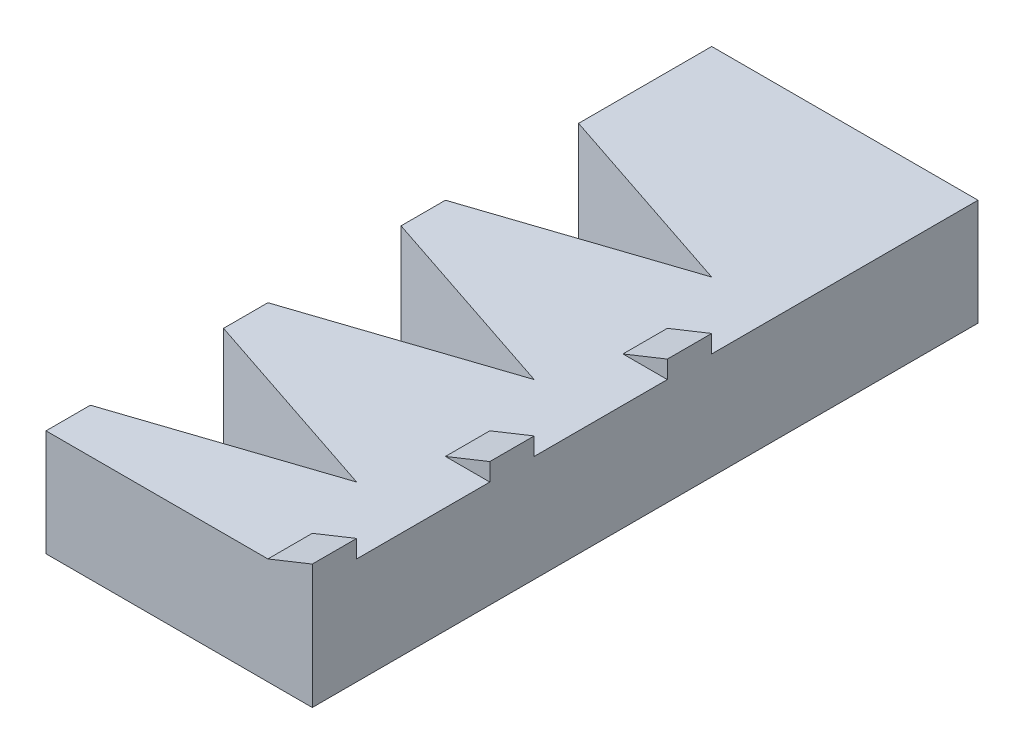
ISO-10303-21;
HEADER;
FILE_DESCRIPTION(('STEP AP214'),'2;1');
FILE_NAME('part.step','',(''),(''),'','','');
FILE_SCHEMA(('AUTOMOTIVE_DESIGN { 1 0 10303 214 1 1 1 1 }'));
ENDSEC;
DATA;
#1=APPLICATION_CONTEXT('core data for automotive mechanical design processes');
#2=APPLICATION_PROTOCOL_DEFINITION('international standard','automotive_design',2000,#1);
#3=PRODUCT_CONTEXT('',#1,'mechanical');
#4=PRODUCT('Part','Part','',(#3));
#5=PRODUCT_RELATED_PRODUCT_CATEGORY('part','',(#4));
#6=PRODUCT_DEFINITION_FORMATION('','',#4);
#7=PRODUCT_DEFINITION_CONTEXT('part definition',#1,'design');
#8=PRODUCT_DEFINITION('design','',#6,#7);
#9=PRODUCT_DEFINITION_SHAPE('','',#8);
#10=(LENGTH_UNIT() NAMED_UNIT(*) SI_UNIT(.MILLI.,.METRE.));
#11=(NAMED_UNIT(*) PLANE_ANGLE_UNIT() SI_UNIT($,.RADIAN.));
#12=(NAMED_UNIT(*) SI_UNIT($,.STERADIAN.) SOLID_ANGLE_UNIT());
#13=UNCERTAINTY_MEASURE_WITH_UNIT(LENGTH_MEASURE(1.E-05),#10,'distance_accuracy_value','');
#14=(GEOMETRIC_REPRESENTATION_CONTEXT(3) GLOBAL_UNCERTAINTY_ASSIGNED_CONTEXT((#13)) GLOBAL_UNIT_ASSIGNED_CONTEXT((#10,
#11,#12)) REPRESENTATION_CONTEXT('',''));
#15=CARTESIAN_POINT('',(0.,0.,0.));
#16=DIRECTION('',(0.,0.,1.));
#17=DIRECTION('',(1.,0.,0.));
#18=AXIS2_PLACEMENT_3D('',#15,#16,#17);
#19=CARTESIAN_POINT('',(0.,12.,0.));
#20=DIRECTION('',(0.,-1.,0.));
#21=DIRECTION('',(0.,0.,-1.));
#22=AXIS2_PLACEMENT_3D('',#19,#20,#21);
#23=PLANE('',#22);
#24=DIRECTION('',(-1.,0.,0.));
#25=VECTOR('',#24,1.);
#26=CARTESIAN_POINT('',(27.5,12.,-5.));
#27=LINE('',#26,#25);
#28=CARTESIAN_POINT('',(30.,12.,-5.));
#29=VERTEX_POINT('',#28);
#30=CARTESIAN_POINT('',(25.,12.,-5.));
#31=VERTEX_POINT('',#30);
#32=EDGE_CURVE('E345',#29,#31,#27,.T.);
#33=ORIENTED_EDGE('',*,*,#32,.F.);
#34=DIRECTION('',(0.,0.,-1.));
#35=VECTOR('',#34,1.);
#36=CARTESIAN_POINT('',(30.,12.,0.));
#37=LINE('',#36,#35);
#38=CARTESIAN_POINT('',(30.,12.,-20.));
#39=VERTEX_POINT('',#38);
#40=EDGE_CURVE('E332',#29,#39,#37,.T.);
#41=ORIENTED_EDGE('',*,*,#40,.T.);
#42=DIRECTION('',(1.,0.,0.));
#43=VECTOR('',#42,1.);
#44=CARTESIAN_POINT('',(27.5,12.,-20.));
#45=LINE('',#44,#43);
#46=CARTESIAN_POINT('',(25.,12.,-20.));
#47=VERTEX_POINT('',#46);
#48=EDGE_CURVE('E352',#47,#39,#45,.T.);
#49=ORIENTED_EDGE('',*,*,#48,.F.);
#50=DIRECTION('',(0.,0.,1.));
#51=VECTOR('',#50,1.);
#52=CARTESIAN_POINT('',(25.,12.,-22.5));
#53=LINE('',#52,#51);
#54=CARTESIAN_POINT('',(25.,12.,-25.));
#55=VERTEX_POINT('',#54);
#56=EDGE_CURVE('E354',#55,#47,#53,.T.);
#57=ORIENTED_EDGE('',*,*,#56,.F.);
#58=DIRECTION('',(-1.,0.,0.));
#59=VECTOR('',#58,1.);
#60=CARTESIAN_POINT('',(27.5,12.,-25.));
#61=LINE('',#60,#59);
#62=CARTESIAN_POINT('',(30.,12.,-25.));
#63=VERTEX_POINT('',#62);
#64=EDGE_CURVE('E376',#63,#55,#61,.T.);
#65=ORIENTED_EDGE('',*,*,#64,.F.);
#66=CARTESIAN_POINT('',(30.,12.,-40.));
#67=VERTEX_POINT('',#66);
#68=EDGE_CURVE('E342',#63,#67,#37,.T.);
#69=ORIENTED_EDGE('',*,*,#68,.T.);
#70=DIRECTION('',(1.,0.,0.));
#71=VECTOR('',#70,1.);
#72=CARTESIAN_POINT('',(27.5,12.,-40.));
#73=LINE('',#72,#71);
#74=CARTESIAN_POINT('',(25.,12.,-40.));
#75=VERTEX_POINT('',#74);
#76=EDGE_CURVE('E366',#75,#67,#73,.T.);
#77=ORIENTED_EDGE('',*,*,#76,.F.);
#78=DIRECTION('',(0.,0.,1.));
#79=VECTOR('',#78,1.);
#80=CARTESIAN_POINT('',(25.,12.,-42.5));
#81=LINE('',#80,#79);
#82=CARTESIAN_POINT('',(25.,12.,-45.));
#83=VERTEX_POINT('',#82);
#84=EDGE_CURVE('E400',#83,#75,#81,.T.);
#85=ORIENTED_EDGE('',*,*,#84,.F.);
#86=DIRECTION('',(-1.,0.,0.));
#87=VECTOR('',#86,1.);
#88=CARTESIAN_POINT('',(27.5,12.,-45.));
#89=LINE('',#88,#87);
#90=CARTESIAN_POINT('',(30.,12.,-45.));
#91=VERTEX_POINT('',#90);
#92=EDGE_CURVE('E397',#91,#83,#89,.T.);
#93=ORIENTED_EDGE('',*,*,#92,.F.);
#94=CARTESIAN_POINT('',(30.,12.,-75.));
#95=VERTEX_POINT('',#94);
#96=EDGE_CURVE('E344',#91,#95,#37,.T.);
#97=ORIENTED_EDGE('',*,*,#96,.T.);
#98=DIRECTION('',(-1.,0.,0.));
#99=VECTOR('',#98,1.);
#100=CARTESIAN_POINT('',(0.,12.,-75.));
#101=LINE('',#100,#99);
#102=CARTESIAN_POINT('',(0.,12.,-75.));
#103=VERTEX_POINT('',#102);
#104=EDGE_CURVE('E341',#95,#103,#101,.T.);
#105=ORIENTED_EDGE('',*,*,#104,.T.);
#106=DIRECTION('',(0.,0.,1.));
#107=VECTOR('',#106,1.);
#108=CARTESIAN_POINT('',(0.,12.,0.));
#109=LINE('',#108,#107);
#110=CARTESIAN_POINT('',(0.,12.,-60.));
#111=VERTEX_POINT('',#110);
#112=EDGE_CURVE('E466',#103,#111,#109,.T.);
#113=ORIENTED_EDGE('',*,*,#112,.T.);
#114=DIRECTION('',(0.948683298050514,0.,0.316227766016838));
#115=VECTOR('',#114,1.);
#116=CARTESIAN_POINT('',(22.5,12.,-52.5));
#117=LINE('',#116,#115);
#118=CARTESIAN_POINT('',(22.5,12.,-52.5));
#119=VERTEX_POINT('',#118);
#120=EDGE_CURVE('E429',#111,#119,#117,.T.);
#121=ORIENTED_EDGE('',*,*,#120,.T.);
#122=DIRECTION('',(-0.948683298050514,0.,0.316227766016838));
#123=VECTOR('',#122,1.);
#124=CARTESIAN_POINT('',(0.,12.,-45.));
#125=LINE('',#124,#123);
#126=CARTESIAN_POINT('',(0.,12.,-45.));
#127=VERTEX_POINT('',#126);
#128=EDGE_CURVE('E414',#119,#127,#125,.T.);
#129=ORIENTED_EDGE('',*,*,#128,.T.);
#130=CARTESIAN_POINT('',(0.,12.,-40.));
#131=VERTEX_POINT('',#130);
#132=EDGE_CURVE('E469',#127,#131,#109,.T.);
#133=ORIENTED_EDGE('',*,*,#132,.T.);
#134=DIRECTION('',(0.948683298050514,0.,0.316227766016838));
#135=VECTOR('',#134,1.);
#136=CARTESIAN_POINT('',(22.5,12.,-32.5));
#137=LINE('',#136,#135);
#138=CARTESIAN_POINT('',(22.5,12.,-32.5));
#139=VERTEX_POINT('',#138);
#140=EDGE_CURVE('E409',#131,#139,#137,.T.);
#141=ORIENTED_EDGE('',*,*,#140,.T.);
#142=DIRECTION('',(-0.948683298050514,0.,0.316227766016838));
#143=VECTOR('',#142,1.);
#144=CARTESIAN_POINT('',(0.,12.,-25.));
#145=LINE('',#144,#143);
#146=CARTESIAN_POINT('',(0.,12.,-25.));
#147=VERTEX_POINT('',#146);
#148=EDGE_CURVE('E405',#139,#147,#145,.T.);
#149=ORIENTED_EDGE('',*,*,#148,.T.);
#150=CARTESIAN_POINT('',(0.,12.,-20.));
#151=VERTEX_POINT('',#150);
#152=EDGE_CURVE('E470',#147,#151,#109,.T.);
#153=ORIENTED_EDGE('',*,*,#152,.T.);
#154=DIRECTION('',(0.948683298050514,0.,0.316227766016838));
#155=VECTOR('',#154,1.);
#156=CARTESIAN_POINT('',(22.5,12.,-12.5));
#157=LINE('',#156,#155);
#158=CARTESIAN_POINT('',(22.5,12.,-12.5));
#159=VERTEX_POINT('',#158);
#160=EDGE_CURVE('E449',#151,#159,#157,.T.);
#161=ORIENTED_EDGE('',*,*,#160,.T.);
#162=DIRECTION('',(-0.948683298050514,0.,0.316227766016838));
#163=VECTOR('',#162,1.);
#164=CARTESIAN_POINT('',(0.,12.,-5.));
#165=LINE('',#164,#163);
#166=CARTESIAN_POINT('',(0.,12.,-5.));
#167=VERTEX_POINT('',#166);
#168=EDGE_CURVE('E445',#159,#167,#165,.T.);
#169=ORIENTED_EDGE('',*,*,#168,.T.);
#170=CARTESIAN_POINT('',(0.,12.,0.));
#171=VERTEX_POINT('',#170);
#172=EDGE_CURVE('E471',#167,#171,#109,.T.);
#173=ORIENTED_EDGE('',*,*,#172,.T.);
#174=DIRECTION('',(1.,0.,0.));
#175=VECTOR('',#174,1.);
#176=CARTESIAN_POINT('',(0.,12.,0.));
#177=LINE('',#176,#175);
#178=CARTESIAN_POINT('',(25.,12.,0.));
#179=VERTEX_POINT('',#178);
#180=EDGE_CURVE('E210',#171,#179,#177,.T.);
#181=ORIENTED_EDGE('',*,*,#180,.T.);
#182=DIRECTION('',(0.,0.,1.));
#183=VECTOR('',#182,1.);
#184=CARTESIAN_POINT('',(25.,12.,-2.5));
#185=LINE('',#184,#183);
#186=EDGE_CURVE('E205',#31,#179,#185,.T.);
#187=ORIENTED_EDGE('',*,*,#186,.F.);
#188=EDGE_LOOP('',(#33,#41,#49,#57,#65,#69,#77,#85,#93,#97,#105,#113,#121,#129,#133,#141,#149,
#153,#161,#169,#173,#181,#187));
#189=FACE_BOUND('',#188,.T.);
#190=ADVANCED_FACE('F190',(#189),#23,.F.);
#191=CARTESIAN_POINT('',(0.,12.,0.));
#192=DIRECTION('',(1.,0.,0.));
#193=DIRECTION('',(0.,0.,-1.));
#194=AXIS2_PLACEMENT_3D('',#191,#192,#193);
#195=PLANE('',#194);
#196=DIRECTION('',(0.,-1.,0.));
#197=VECTOR('',#196,1.);
#198=CARTESIAN_POINT('',(0.,39.0416345659799,-40.));
#199=LINE('',#198,#197);
#200=CARTESIAN_POINT('',(0.,0.,-40.));
#201=VERTEX_POINT('',#200);
#202=EDGE_CURVE('E417',#131,#201,#199,.T.);
#203=ORIENTED_EDGE('',*,*,#202,.F.);
#204=ORIENTED_EDGE('',*,*,#132,.F.);
#205=DIRECTION('',(0.,-1.,0.));
#206=VECTOR('',#205,1.);
#207=CARTESIAN_POINT('',(0.,39.0416345659799,-45.));
#208=LINE('',#207,#206);
#209=CARTESIAN_POINT('',(0.,0.,-45.));
#210=VERTEX_POINT('',#209);
#211=EDGE_CURVE('E440',#127,#210,#208,.T.);
#212=ORIENTED_EDGE('',*,*,#211,.T.);
#213=DIRECTION('',(0.,0.,1.));
#214=VECTOR('',#213,1.);
#215=CARTESIAN_POINT('',(0.,0.,0.));
#216=LINE('',#215,#214);
#217=EDGE_CURVE('E479',#210,#201,#216,.T.);
#218=ORIENTED_EDGE('',*,*,#217,.T.);
#219=EDGE_LOOP('',(#203,#204,#212,#218));
#220=FACE_BOUND('',#219,.T.);
#221=ADVANCED_FACE('F192',(#220),#195,.F.);
#222=DIRECTION('',(0.,-1.,0.));
#223=VECTOR('',#222,1.);
#224=CARTESIAN_POINT('',(0.,39.0416345659799,-25.));
#225=LINE('',#224,#223);
#226=CARTESIAN_POINT('',(0.,0.,-25.));
#227=VERTEX_POINT('',#226);
#228=EDGE_CURVE('E422',#147,#227,#225,.T.);
#229=ORIENTED_EDGE('',*,*,#228,.T.);
#230=CARTESIAN_POINT('',(0.,0.,-20.));
#231=VERTEX_POINT('',#230);
#232=EDGE_CURVE('E480',#227,#231,#216,.T.);
#233=ORIENTED_EDGE('',*,*,#232,.T.);
#234=DIRECTION('',(0.,-1.,0.));
#235=VECTOR('',#234,1.);
#236=CARTESIAN_POINT('',(0.,39.0416345659799,-20.));
#237=LINE('',#236,#235);
#238=EDGE_CURVE('E455',#151,#231,#237,.T.);
#239=ORIENTED_EDGE('',*,*,#238,.F.);
#240=ORIENTED_EDGE('',*,*,#152,.F.);
#241=EDGE_LOOP('',(#229,#233,#239,#240));
#242=FACE_BOUND('',#241,.T.);
#243=ADVANCED_FACE('F538',(#242),#195,.F.);
#244=DIRECTION('',(0.,-1.,0.));
#245=VECTOR('',#244,1.);
#246=CARTESIAN_POINT('',(0.,39.0416345659799,-60.));
#247=LINE('',#246,#245);
#248=CARTESIAN_POINT('',(0.,0.,-60.));
#249=VERTEX_POINT('',#248);
#250=EDGE_CURVE('E435',#111,#249,#247,.T.);
#251=ORIENTED_EDGE('',*,*,#250,.F.);
#252=ORIENTED_EDGE('',*,*,#112,.F.);
#253=DIRECTION('',(0.,-1.,0.));
#254=VECTOR('',#253,1.);
#255=CARTESIAN_POINT('',(0.,12.,-75.));
#256=LINE('',#255,#254);
#257=CARTESIAN_POINT('',(0.,0.,-75.));
#258=VERTEX_POINT('',#257);
#259=EDGE_CURVE('E474',#103,#258,#256,.T.);
#260=ORIENTED_EDGE('',*,*,#259,.T.);
#261=EDGE_CURVE('E475',#258,#249,#216,.T.);
#262=ORIENTED_EDGE('',*,*,#261,.T.);
#263=EDGE_LOOP('',(#251,#252,#260,#262));
#264=FACE_BOUND('',#263,.T.);
#265=ADVANCED_FACE('F508',(#264),#195,.F.);
#266=CARTESIAN_POINT('',(0.,0.,0.));
#267=DIRECTION('',(0.,-1.,0.));
#268=DIRECTION('',(0.,0.,-1.));
#269=AXIS2_PLACEMENT_3D('',#266,#267,#268);
#270=PLANE('',#269);
#271=DIRECTION('',(0.948683298050514,0.,-0.316227766016838));
#272=VECTOR('',#271,1.);
#273=CARTESIAN_POINT('',(0.,0.,-25.));
#274=LINE('',#273,#272);
#275=CARTESIAN_POINT('',(22.5,0.,-32.5));
#276=VERTEX_POINT('',#275);
#277=EDGE_CURVE('E410',#227,#276,#274,.T.);
#278=ORIENTED_EDGE('',*,*,#277,.T.);
#279=DIRECTION('',(-0.948683298050514,0.,-0.316227766016838));
#280=VECTOR('',#279,1.);
#281=CARTESIAN_POINT('',(22.5,0.,-32.5));
#282=LINE('',#281,#280);
#283=EDGE_CURVE('E413',#276,#201,#282,.T.);
#284=ORIENTED_EDGE('',*,*,#283,.T.);
#285=ORIENTED_EDGE('',*,*,#217,.F.);
#286=DIRECTION('',(0.948683298050514,0.,-0.316227766016838));
#287=VECTOR('',#286,1.);
#288=CARTESIAN_POINT('',(0.,0.,-45.));
#289=LINE('',#288,#287);
#290=CARTESIAN_POINT('',(22.5,0.,-52.5));
#291=VERTEX_POINT('',#290);
#292=EDGE_CURVE('E384',#210,#291,#289,.T.);
#293=ORIENTED_EDGE('',*,*,#292,.T.);
#294=DIRECTION('',(-0.948683298050514,0.,-0.316227766016838));
#295=VECTOR('',#294,1.);
#296=CARTESIAN_POINT('',(22.5,0.,-52.5));
#297=LINE('',#296,#295);
#298=EDGE_CURVE('E432',#291,#249,#297,.T.);
#299=ORIENTED_EDGE('',*,*,#298,.T.);
#300=ORIENTED_EDGE('',*,*,#261,.F.);
#301=DIRECTION('',(-1.,0.,0.));
#302=VECTOR('',#301,1.);
#303=CARTESIAN_POINT('',(0.,0.,-75.));
#304=LINE('',#303,#302);
#305=CARTESIAN_POINT('',(30.,0.,-75.));
#306=VERTEX_POINT('',#305);
#307=EDGE_CURVE('E484',#306,#258,#304,.T.);
#308=ORIENTED_EDGE('',*,*,#307,.F.);
#309=DIRECTION('',(0.,0.,-1.));
#310=VECTOR('',#309,1.);
#311=CARTESIAN_POINT('',(30.,0.,0.));
#312=LINE('',#311,#310);
#313=CARTESIAN_POINT('',(30.,0.,0.));
#314=VERTEX_POINT('',#313);
#315=EDGE_CURVE('E482',#314,#306,#312,.T.);
#316=ORIENTED_EDGE('',*,*,#315,.F.);
#317=DIRECTION('',(1.,0.,0.));
#318=VECTOR('',#317,1.);
#319=CARTESIAN_POINT('',(0.,0.,0.));
#320=LINE('',#319,#318);
#321=CARTESIAN_POINT('',(0.,0.,0.));
#322=VERTEX_POINT('',#321);
#323=EDGE_CURVE('E478',#322,#314,#320,.T.);
#324=ORIENTED_EDGE('',*,*,#323,.F.);
#325=CARTESIAN_POINT('',(0.,0.,-5.));
#326=VERTEX_POINT('',#325);
#327=EDGE_CURVE('E448',#326,#322,#216,.T.);
#328=ORIENTED_EDGE('',*,*,#327,.F.);
#329=DIRECTION('',(0.948683298050514,0.,-0.316227766016838));
#330=VECTOR('',#329,1.);
#331=CARTESIAN_POINT('',(0.,0.,-5.));
#332=LINE('',#331,#330);
#333=CARTESIAN_POINT('',(22.5,0.,-12.5));
#334=VERTEX_POINT('',#333);
#335=EDGE_CURVE('E408',#326,#334,#332,.T.);
#336=ORIENTED_EDGE('',*,*,#335,.T.);
#337=DIRECTION('',(-0.948683298050514,0.,-0.316227766016838));
#338=VECTOR('',#337,1.);
#339=CARTESIAN_POINT('',(22.5,0.,-12.5));
#340=LINE('',#339,#338);
#341=EDGE_CURVE('E452',#334,#231,#340,.T.);
#342=ORIENTED_EDGE('',*,*,#341,.T.);
#343=ORIENTED_EDGE('',*,*,#232,.F.);
#344=EDGE_LOOP('',(#278,#284,#285,#293,#299,#300,#308,#316,#324,#328,#336,#342,#343));
#345=FACE_BOUND('',#344,.T.);
#346=ADVANCED_FACE('F498',(#345),#270,.T.);
#347=DIRECTION('',(0.,-1.,0.));
#348=VECTOR('',#347,1.);
#349=CARTESIAN_POINT('',(0.,39.0416345659799,-5.));
#350=LINE('',#349,#348);
#351=EDGE_CURVE('E461',#167,#326,#350,.T.);
#352=ORIENTED_EDGE('',*,*,#351,.T.);
#353=ORIENTED_EDGE('',*,*,#327,.T.);
#354=DIRECTION('',(0.,-1.,0.));
#355=VECTOR('',#354,1.);
#356=CARTESIAN_POINT('',(0.,12.,0.));
#357=LINE('',#356,#355);
#358=EDGE_CURVE('E13',#171,#322,#357,.T.);
#359=ORIENTED_EDGE('',*,*,#358,.F.);
#360=ORIENTED_EDGE('',*,*,#172,.F.);
#361=EDGE_LOOP('',(#352,#353,#359,#360));
#362=FACE_BOUND('',#361,.T.);
#363=ADVANCED_FACE('F540',(#362),#195,.F.);
#364=CARTESIAN_POINT('',(0.,12.,0.));
#365=DIRECTION('',(0.,0.,-1.));
#366=DIRECTION('',(-1.,0.,0.));
#367=AXIS2_PLACEMENT_3D('',#364,#365,#366);
#368=PLANE('',#367);
#369=ORIENTED_EDGE('',*,*,#323,.T.);
#370=DIRECTION('',(0.,-1.,0.));
#371=VECTOR('',#370,1.);
#372=CARTESIAN_POINT('',(30.,12.,0.));
#373=LINE('',#372,#371);
#374=CARTESIAN_POINT('',(30.,14.,0.));
#375=VERTEX_POINT('',#374);
#376=EDGE_CURVE('E198',#375,#314,#373,.T.);
#377=ORIENTED_EDGE('',*,*,#376,.F.);
#378=DIRECTION('',(-0.928476690885259,-0.371390676354104,0.));
#379=VECTOR('',#378,1.);
#380=CARTESIAN_POINT('',(27.5,13.,0.));
#381=LINE('',#380,#379);
#382=EDGE_CURVE('E348',#375,#179,#381,.T.);
#383=ORIENTED_EDGE('',*,*,#382,.T.);
#384=ORIENTED_EDGE('',*,*,#180,.F.);
#385=ORIENTED_EDGE('',*,*,#358,.T.);
#386=EDGE_LOOP('',(#369,#377,#383,#384,#385));
#387=FACE_BOUND('',#386,.T.);
#388=ADVANCED_FACE('F551',(#387),#368,.F.);
#389=CARTESIAN_POINT('',(30.,12.,0.));
#390=DIRECTION('',(-1.,0.,0.));
#391=DIRECTION('',(0.,0.,1.));
#392=AXIS2_PLACEMENT_3D('',#389,#390,#391);
#393=PLANE('',#392);
#394=ORIENTED_EDGE('',*,*,#315,.T.);
#395=DIRECTION('',(0.,-1.,0.));
#396=VECTOR('',#395,1.);
#397=CARTESIAN_POINT('',(30.,12.,-75.));
#398=LINE('',#397,#396);
#399=EDGE_CURVE('E488',#95,#306,#398,.T.);
#400=ORIENTED_EDGE('',*,*,#399,.F.);
#401=ORIENTED_EDGE('',*,*,#96,.F.);
#402=DIRECTION('',(0.,1.,0.));
#403=VECTOR('',#402,1.);
#404=CARTESIAN_POINT('',(30.,13.,-45.));
#405=LINE('',#404,#403);
#406=CARTESIAN_POINT('',(30.,14.,-45.));
#407=VERTEX_POINT('',#406);
#408=EDGE_CURVE('E381',#91,#407,#405,.T.);
#409=ORIENTED_EDGE('',*,*,#408,.T.);
#410=DIRECTION('',(0.,0.,1.));
#411=VECTOR('',#410,1.);
#412=CARTESIAN_POINT('',(30.,14.,-42.5));
#413=LINE('',#412,#411);
#414=CARTESIAN_POINT('',(30.,14.,-40.));
#415=VERTEX_POINT('',#414);
#416=EDGE_CURVE('E388',#407,#415,#413,.T.);
#417=ORIENTED_EDGE('',*,*,#416,.T.);
#418=DIRECTION('',(0.,-1.,0.));
#419=VECTOR('',#418,1.);
#420=CARTESIAN_POINT('',(30.,13.,-40.));
#421=LINE('',#420,#419);
#422=EDGE_CURVE('E394',#415,#67,#421,.T.);
#423=ORIENTED_EDGE('',*,*,#422,.T.);
#424=ORIENTED_EDGE('',*,*,#68,.F.);
#425=DIRECTION('',(0.,1.,0.));
#426=VECTOR('',#425,1.);
#427=CARTESIAN_POINT('',(30.,13.,-25.));
#428=LINE('',#427,#426);
#429=CARTESIAN_POINT('',(30.,14.,-25.));
#430=VERTEX_POINT('',#429);
#431=EDGE_CURVE('E363',#63,#430,#428,.T.);
#432=ORIENTED_EDGE('',*,*,#431,.T.);
#433=DIRECTION('',(0.,0.,1.));
#434=VECTOR('',#433,1.);
#435=CARTESIAN_POINT('',(30.,14.,-22.5));
#436=LINE('',#435,#434);
#437=CARTESIAN_POINT('',(30.,14.,-20.));
#438=VERTEX_POINT('',#437);
#439=EDGE_CURVE('E370',#430,#438,#436,.T.);
#440=ORIENTED_EDGE('',*,*,#439,.T.);
#441=DIRECTION('',(0.,-1.,0.));
#442=VECTOR('',#441,1.);
#443=CARTESIAN_POINT('',(30.,13.,-20.));
#444=LINE('',#443,#442);
#445=EDGE_CURVE('E339',#438,#39,#444,.T.);
#446=ORIENTED_EDGE('',*,*,#445,.T.);
#447=ORIENTED_EDGE('',*,*,#40,.F.);
#448=DIRECTION('',(0.,1.,0.));
#449=VECTOR('',#448,1.);
#450=CARTESIAN_POINT('',(30.,13.,-5.));
#451=LINE('',#450,#449);
#452=CARTESIAN_POINT('',(30.,14.,-5.));
#453=VERTEX_POINT('',#452);
#454=EDGE_CURVE('E336',#29,#453,#451,.T.);
#455=ORIENTED_EDGE('',*,*,#454,.T.);
#456=DIRECTION('',(0.,0.,1.));
#457=VECTOR('',#456,1.);
#458=CARTESIAN_POINT('',(30.,14.,-2.5));
#459=LINE('',#458,#457);
#460=EDGE_CURVE('E356',#453,#375,#459,.T.);
#461=ORIENTED_EDGE('',*,*,#460,.T.);
#462=ORIENTED_EDGE('',*,*,#376,.T.);
#463=EDGE_LOOP('',(#394,#400,#401,#409,#417,#423,#424,#432,#440,#446,#447,#455,#461,#462));
#464=FACE_BOUND('',#463,.T.);
#465=ADVANCED_FACE('F333',(#464),#393,.F.);
#466=CARTESIAN_POINT('',(0.,12.,-75.));
#467=DIRECTION('',(0.,0.,1.));
#468=DIRECTION('',(1.,0.,0.));
#469=AXIS2_PLACEMENT_3D('',#466,#467,#468);
#470=PLANE('',#469);
#471=ORIENTED_EDGE('',*,*,#307,.T.);
#472=ORIENTED_EDGE('',*,*,#259,.F.);
#473=ORIENTED_EDGE('',*,*,#104,.F.);
#474=ORIENTED_EDGE('',*,*,#399,.T.);
#475=EDGE_LOOP('',(#471,#472,#473,#474));
#476=FACE_BOUND('',#475,.T.);
#477=ADVANCED_FACE('F503',(#476),#470,.F.);
#478=CARTESIAN_POINT('',(22.5,39.0416345659799,-12.5));
#479=DIRECTION('',(-0.316227766016838,0.,0.948683298050514));
#480=DIRECTION('',(0.948683298050514,0.,0.316227766016838));
#481=AXIS2_PLACEMENT_3D('',#478,#479,#480);
#482=PLANE('',#481);
#483=ORIENTED_EDGE('',*,*,#238,.T.);
#484=ORIENTED_EDGE('',*,*,#341,.F.);
#485=DIRECTION('',(0.,-1.,0.));
#486=VECTOR('',#485,1.);
#487=CARTESIAN_POINT('',(22.5,39.0416345659799,-12.5));
#488=LINE('',#487,#486);
#489=EDGE_CURVE('E458',#159,#334,#488,.T.);
#490=ORIENTED_EDGE('',*,*,#489,.F.);
#491=ORIENTED_EDGE('',*,*,#160,.F.);
#492=EDGE_LOOP('',(#483,#484,#490,#491));
#493=FACE_BOUND('',#492,.T.);
#494=ADVANCED_FACE('F549',(#493),#482,.T.);
#495=CARTESIAN_POINT('',(0.,39.0416345659799,-5.));
#496=DIRECTION('',(-0.316227766016838,0.,-0.948683298050514));
#497=DIRECTION('',(-0.948683298050514,0.,0.316227766016838));
#498=AXIS2_PLACEMENT_3D('',#495,#496,#497);
#499=PLANE('',#498);
#500=ORIENTED_EDGE('',*,*,#489,.T.);
#501=ORIENTED_EDGE('',*,*,#335,.F.);
#502=ORIENTED_EDGE('',*,*,#351,.F.);
#503=ORIENTED_EDGE('',*,*,#168,.F.);
#504=EDGE_LOOP('',(#500,#501,#502,#503));
#505=FACE_BOUND('',#504,.T.);
#506=ADVANCED_FACE('F543',(#505),#499,.T.);
#507=CARTESIAN_POINT('',(22.5,39.0416345659799,-52.5));
#508=DIRECTION('',(-0.316227766016838,0.,0.948683298050514));
#509=DIRECTION('',(0.948683298050514,0.,0.316227766016838));
#510=AXIS2_PLACEMENT_3D('',#507,#508,#509);
#511=PLANE('',#510);
#512=ORIENTED_EDGE('',*,*,#250,.T.);
#513=ORIENTED_EDGE('',*,*,#298,.F.);
#514=DIRECTION('',(0.,-1.,0.));
#515=VECTOR('',#514,1.);
#516=CARTESIAN_POINT('',(22.5,39.0416345659799,-52.5));
#517=LINE('',#516,#515);
#518=EDGE_CURVE('E437',#119,#291,#517,.T.);
#519=ORIENTED_EDGE('',*,*,#518,.F.);
#520=ORIENTED_EDGE('',*,*,#120,.F.);
#521=EDGE_LOOP('',(#512,#513,#519,#520));
#522=FACE_BOUND('',#521,.T.);
#523=ADVANCED_FACE('F578',(#522),#511,.T.);
#524=CARTESIAN_POINT('',(0.,39.0416345659799,-45.));
#525=DIRECTION('',(-0.316227766016838,0.,-0.948683298050514));
#526=DIRECTION('',(-0.948683298050514,0.,0.316227766016838));
#527=AXIS2_PLACEMENT_3D('',#524,#525,#526);
#528=PLANE('',#527);
#529=ORIENTED_EDGE('',*,*,#518,.T.);
#530=ORIENTED_EDGE('',*,*,#292,.F.);
#531=ORIENTED_EDGE('',*,*,#211,.F.);
#532=ORIENTED_EDGE('',*,*,#128,.F.);
#533=EDGE_LOOP('',(#529,#530,#531,#532));
#534=FACE_BOUND('',#533,.T.);
#535=ADVANCED_FACE('F580',(#534),#528,.T.);
#536=CARTESIAN_POINT('',(22.5,39.0416345659799,-32.5));
#537=DIRECTION('',(-0.316227766016838,0.,0.948683298050514));
#538=DIRECTION('',(0.948683298050514,0.,0.316227766016838));
#539=AXIS2_PLACEMENT_3D('',#536,#537,#538);
#540=PLANE('',#539);
#541=ORIENTED_EDGE('',*,*,#202,.T.);
#542=ORIENTED_EDGE('',*,*,#283,.F.);
#543=DIRECTION('',(0.,-1.,0.));
#544=VECTOR('',#543,1.);
#545=CARTESIAN_POINT('',(22.5,39.0416345659799,-32.5));
#546=LINE('',#545,#544);
#547=EDGE_CURVE('E419',#139,#276,#546,.T.);
#548=ORIENTED_EDGE('',*,*,#547,.F.);
#549=ORIENTED_EDGE('',*,*,#140,.F.);
#550=EDGE_LOOP('',(#541,#542,#548,#549));
#551=FACE_BOUND('',#550,.T.);
#552=ADVANCED_FACE('F529',(#551),#540,.T.);
#553=CARTESIAN_POINT('',(0.,39.0416345659799,-25.));
#554=DIRECTION('',(-0.316227766016838,0.,-0.948683298050514));
#555=DIRECTION('',(-0.948683298050514,0.,0.316227766016838));
#556=AXIS2_PLACEMENT_3D('',#553,#554,#555);
#557=PLANE('',#556);
#558=ORIENTED_EDGE('',*,*,#547,.T.);
#559=ORIENTED_EDGE('',*,*,#277,.F.);
#560=ORIENTED_EDGE('',*,*,#228,.F.);
#561=ORIENTED_EDGE('',*,*,#148,.F.);
#562=EDGE_LOOP('',(#558,#559,#560,#561));
#563=FACE_BOUND('',#562,.T.);
#564=ADVANCED_FACE('F522',(#563),#557,.T.);
#565=CARTESIAN_POINT('',(30.,12.,-45.));
#566=DIRECTION('',(0.,0.,1.));
#567=DIRECTION('',(0.,1.,0.));
#568=AXIS2_PLACEMENT_3D('',#565,#566,#567);
#569=PLANE('',#568);
#570=ORIENTED_EDGE('',*,*,#408,.F.);
#571=ORIENTED_EDGE('',*,*,#92,.T.);
#572=DIRECTION('',(-0.928476690885259,-0.371390676354104,0.));
#573=VECTOR('',#572,1.);
#574=CARTESIAN_POINT('',(27.5,13.,-45.));
#575=LINE('',#574,#573);
#576=EDGE_CURVE('E385',#407,#83,#575,.T.);
#577=ORIENTED_EDGE('',*,*,#576,.F.);
#578=EDGE_LOOP('',(#570,#571,#577));
#579=FACE_BOUND('',#578,.T.);
#580=ADVANCED_FACE('F520',(#579),#569,.F.);
#581=CARTESIAN_POINT('',(30.,14.,-45.));
#582=DIRECTION('',(0.371390676354104,-0.928476690885259,0.));
#583=DIRECTION('',(0.,0.,1.));
#584=AXIS2_PLACEMENT_3D('',#581,#582,#583);
#585=PLANE('',#584);
#586=ORIENTED_EDGE('',*,*,#416,.F.);
#587=ORIENTED_EDGE('',*,*,#576,.T.);
#588=ORIENTED_EDGE('',*,*,#84,.T.);
#589=DIRECTION('',(-0.928476690885259,-0.371390676354104,0.));
#590=VECTOR('',#589,1.);
#591=CARTESIAN_POINT('',(27.5,13.,-40.));
#592=LINE('',#591,#590);
#593=EDGE_CURVE('E391',#415,#75,#592,.T.);
#594=ORIENTED_EDGE('',*,*,#593,.F.);
#595=EDGE_LOOP('',(#586,#587,#588,#594));
#596=FACE_BOUND('',#595,.T.);
#597=ADVANCED_FACE('F517',(#596),#585,.F.);
#598=CARTESIAN_POINT('',(30.,14.,-40.));
#599=DIRECTION('',(0.,0.,-1.));
#600=DIRECTION('',(0.,-1.,0.));
#601=AXIS2_PLACEMENT_3D('',#598,#599,#600);
#602=PLANE('',#601);
#603=ORIENTED_EDGE('',*,*,#422,.F.);
#604=ORIENTED_EDGE('',*,*,#593,.T.);
#605=ORIENTED_EDGE('',*,*,#76,.T.);
#606=EDGE_LOOP('',(#603,#604,#605));
#607=FACE_BOUND('',#606,.T.);
#608=ADVANCED_FACE('F515',(#607),#602,.F.);
#609=CARTESIAN_POINT('',(30.,12.,-25.));
#610=DIRECTION('',(0.,0.,1.));
#611=DIRECTION('',(0.,1.,0.));
#612=AXIS2_PLACEMENT_3D('',#609,#610,#611);
#613=PLANE('',#612);
#614=ORIENTED_EDGE('',*,*,#431,.F.);
#615=ORIENTED_EDGE('',*,*,#64,.T.);
#616=DIRECTION('',(-0.928476690885259,-0.371390676354104,0.));
#617=VECTOR('',#616,1.);
#618=CARTESIAN_POINT('',(27.5,13.,-25.));
#619=LINE('',#618,#617);
#620=EDGE_CURVE('E367',#430,#55,#619,.T.);
#621=ORIENTED_EDGE('',*,*,#620,.F.);
#622=EDGE_LOOP('',(#614,#615,#621));
#623=FACE_BOUND('',#622,.T.);
#624=ADVANCED_FACE('F590',(#623),#613,.F.);
#625=CARTESIAN_POINT('',(30.,14.,-25.));
#626=DIRECTION('',(0.371390676354104,-0.928476690885259,0.));
#627=DIRECTION('',(0.,0.,1.));
#628=AXIS2_PLACEMENT_3D('',#625,#626,#627);
#629=PLANE('',#628);
#630=ORIENTED_EDGE('',*,*,#439,.F.);
#631=ORIENTED_EDGE('',*,*,#620,.T.);
#632=ORIENTED_EDGE('',*,*,#56,.T.);
#633=DIRECTION('',(-0.928476690885259,-0.371390676354104,0.));
#634=VECTOR('',#633,1.);
#635=CARTESIAN_POINT('',(27.5,13.,-20.));
#636=LINE('',#635,#634);
#637=EDGE_CURVE('E372',#438,#47,#636,.T.);
#638=ORIENTED_EDGE('',*,*,#637,.F.);
#639=EDGE_LOOP('',(#630,#631,#632,#638));
#640=FACE_BOUND('',#639,.T.);
#641=ADVANCED_FACE('F594',(#640),#629,.F.);
#642=CARTESIAN_POINT('',(30.,14.,-20.));
#643=DIRECTION('',(0.,0.,-1.));
#644=DIRECTION('',(0.,-1.,0.));
#645=AXIS2_PLACEMENT_3D('',#642,#643,#644);
#646=PLANE('',#645);
#647=ORIENTED_EDGE('',*,*,#445,.F.);
#648=ORIENTED_EDGE('',*,*,#637,.T.);
#649=ORIENTED_EDGE('',*,*,#48,.T.);
#650=EDGE_LOOP('',(#647,#648,#649));
#651=FACE_BOUND('',#650,.T.);
#652=ADVANCED_FACE('F600',(#651),#646,.F.);
#653=CARTESIAN_POINT('',(30.,12.,-5.));
#654=DIRECTION('',(0.,0.,1.));
#655=DIRECTION('',(0.,1.,0.));
#656=AXIS2_PLACEMENT_3D('',#653,#654,#655);
#657=PLANE('',#656);
#658=ORIENTED_EDGE('',*,*,#454,.F.);
#659=ORIENTED_EDGE('',*,*,#32,.T.);
#660=DIRECTION('',(-0.928476690885259,-0.371390676354104,0.));
#661=VECTOR('',#660,1.);
#662=CARTESIAN_POINT('',(27.5,13.,-5.));
#663=LINE('',#662,#661);
#664=EDGE_CURVE('E351',#453,#31,#663,.T.);
#665=ORIENTED_EDGE('',*,*,#664,.F.);
#666=EDGE_LOOP('',(#658,#659,#665));
#667=FACE_BOUND('',#666,.T.);
#668=ADVANCED_FACE('F350',(#667),#657,.F.);
#669=CARTESIAN_POINT('',(30.,14.,-5.));
#670=DIRECTION('',(0.371390676354104,-0.928476690885259,0.));
#671=DIRECTION('',(0.,0.,1.));
#672=AXIS2_PLACEMENT_3D('',#669,#670,#671);
#673=PLANE('',#672);
#674=ORIENTED_EDGE('',*,*,#460,.F.);
#675=ORIENTED_EDGE('',*,*,#664,.T.);
#676=ORIENTED_EDGE('',*,*,#186,.T.);
#677=ORIENTED_EDGE('',*,*,#382,.F.);
#678=EDGE_LOOP('',(#674,#675,#676,#677));
#679=FACE_BOUND('',#678,.T.);
#680=ADVANCED_FACE('F604',(#679),#673,.F.);
#681=CLOSED_SHELL('',(#190,#221,#243,#265,#346,#363,#388,#465,#477,#494,#506,#523,#535,#552,
#564,#580,#597,#608,#624,#641,#652,#668,#680));
#682=MANIFOLD_SOLID_BREP('B2',#681);
#683=ADVANCED_BREP_SHAPE_REPRESENTATION('',(#18,#682),#14);
#684=SHAPE_DEFINITION_REPRESENTATION(#9,#683);
ENDSEC;
END-ISO-10303-21;
